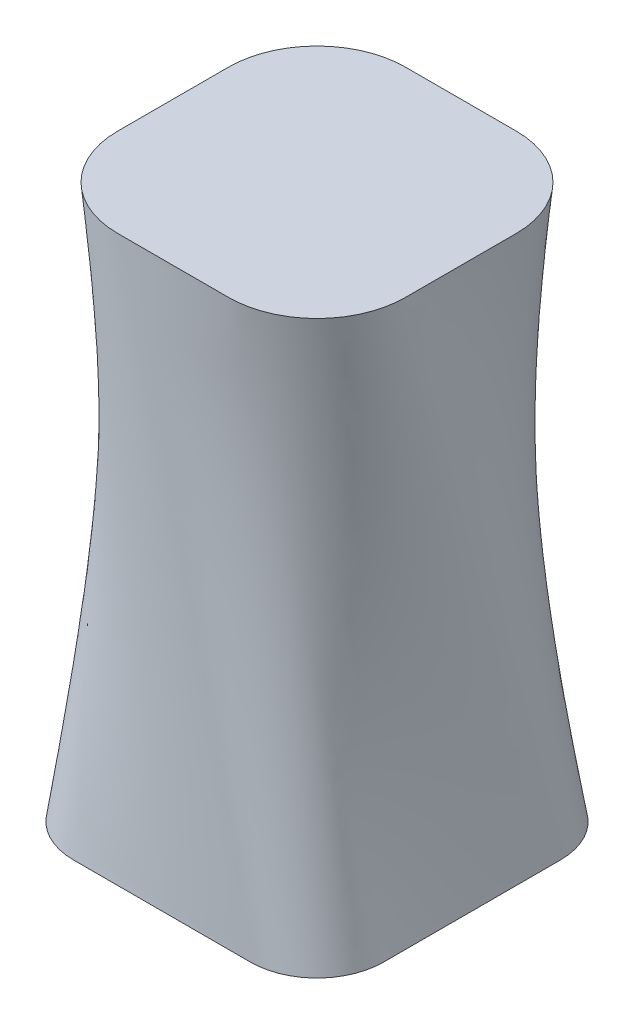
ISO-10303-21;
HEADER;
FILE_DESCRIPTION(('STEP AP214'),'2;1');
FILE_NAME('part.step','',(''),(''),'','','');
FILE_SCHEMA(('AUTOMOTIVE_DESIGN { 1 0 10303 214 1 1 1 1 }'));
ENDSEC;
DATA;
#1=APPLICATION_CONTEXT('core data for automotive mechanical design processes');
#2=APPLICATION_PROTOCOL_DEFINITION('international standard','automotive_design',2000,#1);
#3=PRODUCT_CONTEXT('',#1,'mechanical');
#4=PRODUCT('Part','Part','',(#3));
#5=PRODUCT_RELATED_PRODUCT_CATEGORY('part','',(#4));
#6=PRODUCT_DEFINITION_FORMATION('','',#4);
#7=PRODUCT_DEFINITION_CONTEXT('part definition',#1,'design');
#8=PRODUCT_DEFINITION('design','',#6,#7);
#9=PRODUCT_DEFINITION_SHAPE('','',#8);
#10=(LENGTH_UNIT() NAMED_UNIT(*) SI_UNIT(.MILLI.,.METRE.));
#11=(NAMED_UNIT(*) PLANE_ANGLE_UNIT() SI_UNIT($,.RADIAN.));
#12=(NAMED_UNIT(*) SI_UNIT($,.STERADIAN.) SOLID_ANGLE_UNIT());
#13=UNCERTAINTY_MEASURE_WITH_UNIT(LENGTH_MEASURE(1.E-05),#10,'distance_accuracy_value','');
#14=(GEOMETRIC_REPRESENTATION_CONTEXT(3) GLOBAL_UNCERTAINTY_ASSIGNED_CONTEXT((#13)) GLOBAL_UNIT_ASSIGNED_CONTEXT((#10,
#11,#12)) REPRESENTATION_CONTEXT('',''));
#15=CARTESIAN_POINT('',(0.,0.,0.));
#16=DIRECTION('',(0.,0.,1.));
#17=DIRECTION('',(1.,0.,0.));
#18=AXIS2_PLACEMENT_3D('',#15,#16,#17);
#19=CARTESIAN_POINT('',(-2.5,25.,2.5));
#20=DIRECTION('',(0.,1.,0.));
#21=DIRECTION('',(0.,0.,1.));
#22=AXIS2_PLACEMENT_3D('',#19,#20,#21);
#23=PLANE('',#22);
#24=DIRECTION('',(0.,0.,1.));
#25=VECTOR('',#24,1.);
#26=CARTESIAN_POINT('',(-6.5,25.,-2.49999999999997));
#27=LINE('',#26,#25);
#28=CARTESIAN_POINT('',(-6.5,25.,-2.49999999999997));
#29=VERTEX_POINT('',#28);
#30=CARTESIAN_POINT('',(-6.5,25.,2.49999999984993));
#31=VERTEX_POINT('',#30);
#32=EDGE_CURVE('E422',#29,#31,#27,.T.);
#33=ORIENTED_EDGE('',*,*,#32,.T.);
#34=CARTESIAN_POINT('',(-2.5,25.,2.5));
#35=DIRECTION('',(0.,1.,0.));
#36=DIRECTION('',(0.,0.,1.));
#37=AXIS2_PLACEMENT_3D('',#34,#35,#36);
#38=CIRCLE('',#37,4.);
#39=CARTESIAN_POINT('',(-2.49999999999887,25.,6.5));
#40=VERTEX_POINT('',#39);
#41=EDGE_CURVE('E537',#31,#40,#38,.T.);
#42=ORIENTED_EDGE('',*,*,#41,.T.);
#43=DIRECTION('',(1.,0.,0.));
#44=VECTOR('',#43,1.);
#45=CARTESIAN_POINT('',(-2.49999999999997,25.,6.5));
#46=LINE('',#45,#44);
#47=CARTESIAN_POINT('',(2.50000000000352,25.,6.5));
#48=VERTEX_POINT('',#47);
#49=EDGE_CURVE('E529',#40,#48,#46,.T.);
#50=ORIENTED_EDGE('',*,*,#49,.T.);
#51=CARTESIAN_POINT('',(2.5,25.,2.5));
#52=DIRECTION('',(0.,1.,0.));
#53=DIRECTION('',(0.,0.,1.));
#54=AXIS2_PLACEMENT_3D('',#51,#52,#53);
#55=CIRCLE('',#54,4.);
#56=CARTESIAN_POINT('',(6.5,25.,2.49999999999201));
#57=VERTEX_POINT('',#56);
#58=EDGE_CURVE('E523',#48,#57,#55,.T.);
#59=ORIENTED_EDGE('',*,*,#58,.T.);
#60=DIRECTION('',(0.,0.,1.));
#61=VECTOR('',#60,1.);
#62=CARTESIAN_POINT('',(6.5,25.,-2.49999999999997));
#63=LINE('',#62,#61);
#64=CARTESIAN_POINT('',(6.5,25.,-2.50000000000028));
#65=VERTEX_POINT('',#64);
#66=EDGE_CURVE('E515',#65,#57,#63,.T.);
#67=ORIENTED_EDGE('',*,*,#66,.F.);
#68=CARTESIAN_POINT('',(2.5,25.,-2.5));
#69=DIRECTION('',(0.,1.,0.));
#70=DIRECTION('',(0.,0.,1.));
#71=AXIS2_PLACEMENT_3D('',#68,#69,#70);
#72=CIRCLE('',#71,4.);
#73=CARTESIAN_POINT('',(2.49999999999435,25.,-6.5));
#74=VERTEX_POINT('',#73);
#75=EDGE_CURVE('E507',#65,#74,#72,.T.);
#76=ORIENTED_EDGE('',*,*,#75,.T.);
#77=DIRECTION('',(1.,0.,0.));
#78=VECTOR('',#77,1.);
#79=CARTESIAN_POINT('',(-2.49999999999997,25.,-6.5));
#80=LINE('',#79,#78);
#81=CARTESIAN_POINT('',(-2.49999999999997,25.,-6.5));
#82=VERTEX_POINT('',#81);
#83=EDGE_CURVE('E243',#82,#74,#80,.T.);
#84=ORIENTED_EDGE('',*,*,#83,.F.);
#85=CARTESIAN_POINT('',(-2.5,25.,-2.5));
#86=DIRECTION('',(0.,1.,0.));
#87=DIRECTION('',(0.,0.,1.));
#88=AXIS2_PLACEMENT_3D('',#85,#86,#87);
#89=CIRCLE('',#88,4.);
#90=EDGE_CURVE('E12',#82,#29,#89,.T.);
#91=ORIENTED_EDGE('',*,*,#90,.T.);
#92=EDGE_LOOP('',(#33,#42,#50,#59,#67,#76,#84,#91));
#93=FACE_BOUND('',#92,.T.);
#94=ADVANCED_FACE('F231',(#93),#23,.T.);
#95=CARTESIAN_POINT('',(-4.,0.,4.));
#96=DIRECTION('',(0.,1.,0.));
#97=DIRECTION('',(0.,0.,1.));
#98=AXIS2_PLACEMENT_3D('',#95,#96,#97);
#99=PLANE('',#98);
#100=DIRECTION('',(0.,0.,1.));
#101=VECTOR('',#100,1.);
#102=CARTESIAN_POINT('',(-7.,0.,-3.99999999999998));
#103=LINE('',#102,#101);
#104=CARTESIAN_POINT('',(-7.,0.,-3.99999999999998));
#105=VERTEX_POINT('',#104);
#106=CARTESIAN_POINT('',(-7.,0.,3.99999999999998));
#107=VERTEX_POINT('',#106);
#108=EDGE_CURVE('E303',#105,#107,#103,.T.);
#109=ORIENTED_EDGE('',*,*,#108,.F.);
#110=CARTESIAN_POINT('',(-4.,0.,-4.));
#111=DIRECTION('',(0.,1.,0.));
#112=DIRECTION('',(0.,0.,1.));
#113=AXIS2_PLACEMENT_3D('',#110,#111,#112);
#114=CIRCLE('',#113,3.);
#115=CARTESIAN_POINT('',(-3.99999999999998,0.,-7.));
#116=VERTEX_POINT('',#115);
#117=EDGE_CURVE('E312',#116,#105,#114,.T.);
#118=ORIENTED_EDGE('',*,*,#117,.F.);
#119=DIRECTION('',(1.,0.,0.));
#120=VECTOR('',#119,1.);
#121=CARTESIAN_POINT('',(-3.99999999999998,0.,-7.));
#122=LINE('',#121,#120);
#123=CARTESIAN_POINT('',(3.99999999999998,0.,-7.));
#124=VERTEX_POINT('',#123);
#125=EDGE_CURVE('E427',#116,#124,#122,.T.);
#126=ORIENTED_EDGE('',*,*,#125,.T.);
#127=CARTESIAN_POINT('',(4.,0.,-4.));
#128=DIRECTION('',(0.,1.,0.));
#129=DIRECTION('',(0.,0.,1.));
#130=AXIS2_PLACEMENT_3D('',#127,#128,#129);
#131=CIRCLE('',#130,3.);
#132=CARTESIAN_POINT('',(7.,0.,-3.99999999999998));
#133=VERTEX_POINT('',#132);
#134=EDGE_CURVE('E441',#133,#124,#131,.T.);
#135=ORIENTED_EDGE('',*,*,#134,.F.);
#136=DIRECTION('',(0.,0.,1.));
#137=VECTOR('',#136,1.);
#138=CARTESIAN_POINT('',(7.,0.,-3.99999999999998));
#139=LINE('',#138,#137);
#140=CARTESIAN_POINT('',(7.,0.,3.99999999999998));
#141=VERTEX_POINT('',#140);
#142=EDGE_CURVE('E446',#133,#141,#139,.T.);
#143=ORIENTED_EDGE('',*,*,#142,.T.);
#144=CARTESIAN_POINT('',(4.,0.,4.));
#145=DIRECTION('',(0.,1.,0.));
#146=DIRECTION('',(0.,0.,1.));
#147=AXIS2_PLACEMENT_3D('',#144,#145,#146);
#148=CIRCLE('',#147,3.);
#149=CARTESIAN_POINT('',(3.99999999999998,0.,7.));
#150=VERTEX_POINT('',#149);
#151=EDGE_CURVE('E461',#150,#141,#148,.T.);
#152=ORIENTED_EDGE('',*,*,#151,.F.);
#153=DIRECTION('',(1.,0.,0.));
#154=VECTOR('',#153,1.);
#155=CARTESIAN_POINT('',(-3.99999999999998,0.,7.));
#156=LINE('',#155,#154);
#157=CARTESIAN_POINT('',(-4.,0.,7.));
#158=VERTEX_POINT('',#157);
#159=EDGE_CURVE('E305',#158,#150,#156,.T.);
#160=ORIENTED_EDGE('',*,*,#159,.F.);
#161=CARTESIAN_POINT('',(-4.,0.,4.));
#162=DIRECTION('',(0.,1.,0.));
#163=DIRECTION('',(0.,0.,1.));
#164=AXIS2_PLACEMENT_3D('',#161,#162,#163);
#165=CIRCLE('',#164,3.);
#166=EDGE_CURVE('E300',#107,#158,#165,.T.);
#167=ORIENTED_EDGE('',*,*,#166,.F.);
#168=EDGE_LOOP('',(#109,#118,#126,#135,#143,#152,#160,#167));
#169=FACE_BOUND('',#168,.T.);
#170=ADVANCED_FACE('F297',(#169),#99,.F.);
#171=CARTESIAN_POINT('',(-3.99999999833651,0.,7.));
#172=CARTESIAN_POINT('',(-6.5,25.,2.4999999985235));
#173=CARTESIAN_POINT('',(-3.37170601841677,0.,7.));
#174=CARTESIAN_POINT('',(-6.5,25.,3.0576573676593));
#175=CARTESIAN_POINT('',(-2.06277477116017,0.,7.));
#176=CARTESIAN_POINT('',(-6.26941355391598,25.,4.11388775706122));
#177=CARTESIAN_POINT('',(0.,0.,7.));
#178=CARTESIAN_POINT('',(-5.39683057487307,25.,5.39683057487305));
#179=CARTESIAN_POINT('',(2.06277477116015,0.,7.));
#180=CARTESIAN_POINT('',(-4.11388775706125,25.,6.26941355391597));
#181=CARTESIAN_POINT('',(3.37170601841675,0.,7.));
#182=CARTESIAN_POINT('',(-3.05765736765933,25.,6.5));
#183=CARTESIAN_POINT('',(4.43107176397732,0.,7.));
#184=CARTESIAN_POINT('',(-2.11739192902283,25.,6.5));
#185=CARTESIAN_POINT('',(5.22425858787033,0.,6.8191407420094));
#186=CARTESIAN_POINT('',(-1.30784351058782,25.,6.50000000000001));
#187=CARTESIAN_POINT('',(6.17119506792494,0.,6.17119506792494));
#188=CARTESIAN_POINT('',(0.,25.,6.49999999999999));
#189=CARTESIAN_POINT('',(6.8191407420094,0.,5.22425858787033));
#190=CARTESIAN_POINT('',(1.30784351058779,25.,6.50000000000001));
#191=CARTESIAN_POINT('',(7.,0.,4.43107176397733));
#192=CARTESIAN_POINT('',(2.1173919290228,25.,6.5));
#193=CARTESIAN_POINT('',(7.,0.,3.37170601841675));
#194=CARTESIAN_POINT('',(3.0576573676593,25.,6.50000000000001));
#195=CARTESIAN_POINT('',(6.99999999999999,0.,2.06277477116015));
#196=CARTESIAN_POINT('',(4.11388775706122,25.,6.26941355391597));
#197=CARTESIAN_POINT('',(7.,0.,0.));
#198=CARTESIAN_POINT('',(5.39683057487306,25.,5.39683057487308));
#199=CARTESIAN_POINT('',(7.,0.,-2.06277477116015));
#200=CARTESIAN_POINT('',(6.26941355391598,25.,4.11388775706121));
#201=CARTESIAN_POINT('',(7.,0.,-3.37170601841675));
#202=CARTESIAN_POINT('',(6.50000000000001,25.,3.0576573676593));
#203=CARTESIAN_POINT('',(7.,0.,-4.43107176397732));
#204=CARTESIAN_POINT('',(6.5,25.,2.1173919290228));
#205=CARTESIAN_POINT('',(6.8191407420094,0.,-5.22425858787032));
#206=CARTESIAN_POINT('',(6.5,25.,1.30784351058779));
#207=CARTESIAN_POINT('',(6.17119506792495,0.,-6.17119506792495));
#208=CARTESIAN_POINT('',(6.5,25.,0.));
#209=CARTESIAN_POINT('',(5.22425858787032,0.,-6.81914074200939));
#210=CARTESIAN_POINT('',(6.5,25.,-1.30784351058779));
#211=CARTESIAN_POINT('',(4.43107176397732,0.,-7.));
#212=CARTESIAN_POINT('',(6.5,25.,-2.1173919290228));
#213=CARTESIAN_POINT('',(3.37170601841675,0.,-7.));
#214=CARTESIAN_POINT('',(6.5,25.,-3.0576573676593));
#215=CARTESIAN_POINT('',(2.06277477116015,0.,-7.00000000000001));
#216=CARTESIAN_POINT('',(6.26941355391598,25.,-4.11388775706123));
#217=CARTESIAN_POINT('',(0.,0.,-6.99999999999999));
#218=CARTESIAN_POINT('',(5.39683057487307,25.,-5.39683057487306));
#219=CARTESIAN_POINT('',(-2.06277477116015,0.,-7.));
#220=CARTESIAN_POINT('',(4.11388775706122,25.,-6.26941355391599));
#221=CARTESIAN_POINT('',(-3.37170601841675,0.,-7.));
#222=CARTESIAN_POINT('',(3.05765736765931,25.,-6.5));
#223=CARTESIAN_POINT('',(-4.43107176397732,0.,-7.));
#224=CARTESIAN_POINT('',(2.1173919290228,25.,-6.5));
#225=CARTESIAN_POINT('',(-5.22425858787032,0.,-6.81914074200938));
#226=CARTESIAN_POINT('',(1.30784351058779,25.,-6.5));
#227=CARTESIAN_POINT('',(-6.17119506792495,0.,-6.17119506792496));
#228=CARTESIAN_POINT('',(0.,25.,-6.50000000000001));
#229=CARTESIAN_POINT('',(-6.81914074200939,0.,-5.22425858787031));
#230=CARTESIAN_POINT('',(-1.30784351058779,25.,-6.5));
#231=CARTESIAN_POINT('',(-7.,0.,-4.43107176397733));
#232=CARTESIAN_POINT('',(-2.1173919290228,25.,-6.5));
#233=CARTESIAN_POINT('',(-7.,0.,-3.37170601841675));
#234=CARTESIAN_POINT('',(-3.0576573676593,25.,-6.5));
#235=CARTESIAN_POINT('',(-7.00000000000001,0.,-2.06277477116016));
#236=CARTESIAN_POINT('',(-4.11388775706123,25.0000000000001,-6.26941355391598));
#237=CARTESIAN_POINT('',(-6.99999999999999,0.,0.));
#238=CARTESIAN_POINT('',(-5.39683057487305,24.9999999999999,-5.39683057487307));
#239=CARTESIAN_POINT('',(-7.00000000000001,0.,2.06277477116015));
#240=CARTESIAN_POINT('',(-6.26941355391599,25.0000000000001,-4.11388775706122));
#241=CARTESIAN_POINT('',(-7.,0.,3.37170601841675));
#242=CARTESIAN_POINT('',(-6.5,25.,-3.05765736765931));
#243=CARTESIAN_POINT('',(-7.,0.,4.43107176397732));
#244=CARTESIAN_POINT('',(-6.5,25.,-2.1173919290228));
#245=CARTESIAN_POINT('',(-6.8191407420094,0.,5.22425858787032));
#246=CARTESIAN_POINT('',(-6.49999999999999,25.,-1.30784351058779));
#247=CARTESIAN_POINT('',(-6.17119506792495,0.,6.17119506792493));
#248=CARTESIAN_POINT('',(-6.50000000000001,25.,0.));
#249=CARTESIAN_POINT('',(-5.22425858787034,0.,6.8191407420094));
#250=CARTESIAN_POINT('',(-6.5,25.,1.3078435105878));
#251=CARTESIAN_POINT('',(-4.43107176397734,0.,7.));
#252=CARTESIAN_POINT('',(-6.5,25.,2.1173919290228));
#253=CARTESIAN_POINT('',(-3.99999999833651,0.,7.));
#254=CARTESIAN_POINT('',(-6.5,25.,2.4999999985235));
#255=B_SPLINE_SURFACE_WITH_KNOTS('',3,1,((#171,#172),(#173,#174),(#175,#176),(#177,#178),(#179,
#180),(#181,#182),(#183,#184),(#185,#186),(#187,#188),(#189,#190),(#191,#192),(#193,#194),(#195,
#196),(#197,#198),(#199,#200),(#201,#202),(#203,#204),(#205,#206),(#207,#208),(#209,#210),(#211,
#212),(#213,#214),(#215,#216),(#217,#218),(#219,#220),(#221,#222),(#223,#224),(#225,#226),(#227,
#228),(#229,#230),(#231,#232),(#233,#234),(#235,#236),(#237,#238),(#239,#240),(#241,#242),(#243,
#244),(#245,#246),(#247,#248),(#249,#250),(#251,#252),(#253,#254)),.UNSPECIFIED.,.T.,.F.,.F.,(4,
1,1,1,2,1,1,1,2,1,1,1,2,1,1,1,2,1,1,1,2,1,1,1,2,1,1,1,2,1,1,1,4),(2,2),(0.,0.0370678152560087,
0.0741356305120174,0.111203445768026,0.148271261024035,0.173703445768026,0.199135630512017,
0.224567815256009,0.25,0.287067815256009,0.324135630512018,0.361203445768027,0.398271261024035,
0.423703445768026,0.449135630512018,0.474567815256009,0.5,0.537067815256009,0.574135630512018,
0.611203445768026,0.648271261024035,0.673703445768026,0.699135630512018,0.724567815256009,0.75,
0.787067815256009,0.824135630512018,0.861203445768026,0.898271261024035,0.923703445768026,
0.949135630512018,0.974567815256009,1.),(0.,1.),.UNSPECIFIED.);
#256=ORIENTED_EDGE('',*,*,#117,.T.);
#257=ORIENTED_EDGE('',*,*,#108,.T.);
#258=ORIENTED_EDGE('',*,*,#166,.T.);
#259=ORIENTED_EDGE('',*,*,#159,.T.);
#260=ORIENTED_EDGE('',*,*,#151,.T.);
#261=ORIENTED_EDGE('',*,*,#142,.F.);
#262=ORIENTED_EDGE('',*,*,#134,.T.);
#263=ORIENTED_EDGE('',*,*,#125,.F.);
#264=EDGE_LOOP('',(#256,#257,#258,#259,#260,#261,#262,#263));
#265=FACE_BOUND('',#264,.T.);
#266=ORIENTED_EDGE('',*,*,#83,.T.);
#267=ORIENTED_EDGE('',*,*,#75,.F.);
#268=ORIENTED_EDGE('',*,*,#66,.T.);
#269=ORIENTED_EDGE('',*,*,#58,.F.);
#270=ORIENTED_EDGE('',*,*,#49,.F.);
#271=ORIENTED_EDGE('',*,*,#41,.F.);
#272=ORIENTED_EDGE('',*,*,#32,.F.);
#273=ORIENTED_EDGE('',*,*,#90,.F.);
#274=EDGE_LOOP('',(#266,#267,#268,#269,#270,#271,#272,#273));
#275=FACE_BOUND('',#274,.T.);
#276=ADVANCED_FACE('F315',(#265,#275),#255,.T.);
#277=CLOSED_SHELL('',(#94,#170,#276));
#278=MANIFOLD_SOLID_BREP('B2',#277);
#279=ADVANCED_BREP_SHAPE_REPRESENTATION('',(#18,#278),#14);
#280=SHAPE_DEFINITION_REPRESENTATION(#9,#279);
ENDSEC;
END-ISO-10303-21;
